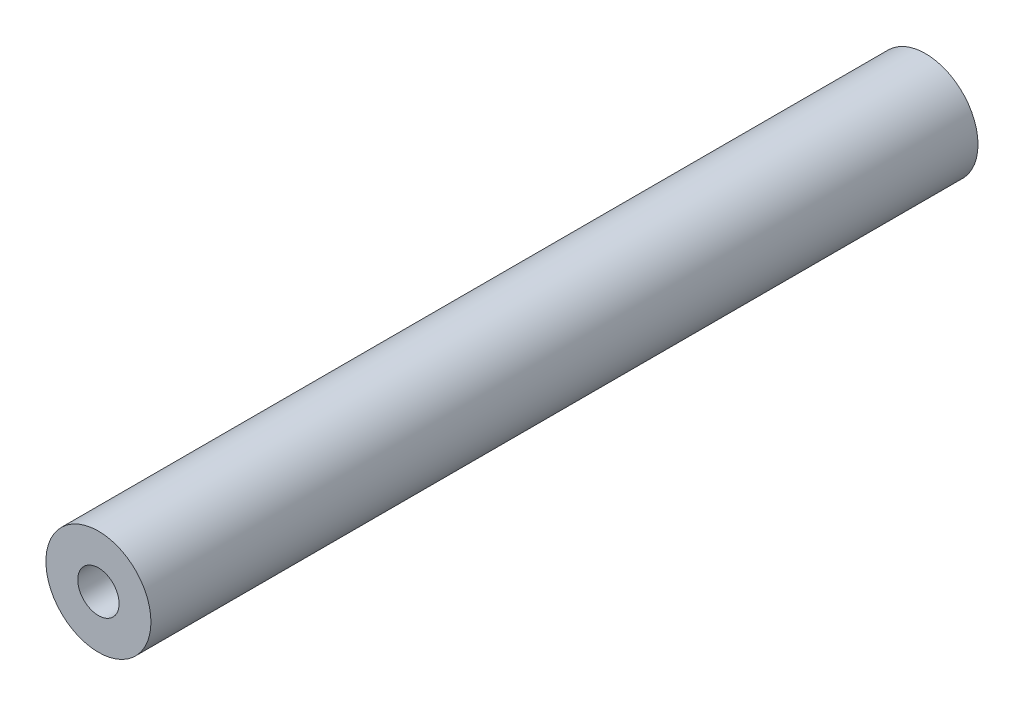
ISO-10303-21;
HEADER;
FILE_DESCRIPTION(('STEP AP214'),'2;1');
FILE_NAME('part.step','',(''),(''),'','','');
FILE_SCHEMA(('AUTOMOTIVE_DESIGN { 1 0 10303 214 1 1 1 1 }'));
ENDSEC;
DATA;
#1=APPLICATION_CONTEXT('core data for automotive mechanical design processes');
#2=APPLICATION_PROTOCOL_DEFINITION('international standard','automotive_design',2000,#1);
#3=PRODUCT_CONTEXT('',#1,'mechanical');
#4=PRODUCT('Part','Part','',(#3));
#5=PRODUCT_RELATED_PRODUCT_CATEGORY('part','',(#4));
#6=PRODUCT_DEFINITION_FORMATION('','',#4);
#7=PRODUCT_DEFINITION_CONTEXT('part definition',#1,'design');
#8=PRODUCT_DEFINITION('design','',#6,#7);
#9=PRODUCT_DEFINITION_SHAPE('','',#8);
#10=(LENGTH_UNIT() NAMED_UNIT(*) SI_UNIT(.MILLI.,.METRE.));
#11=(NAMED_UNIT(*) PLANE_ANGLE_UNIT() SI_UNIT($,.RADIAN.));
#12=(NAMED_UNIT(*) SI_UNIT($,.STERADIAN.) SOLID_ANGLE_UNIT());
#13=UNCERTAINTY_MEASURE_WITH_UNIT(LENGTH_MEASURE(1.E-05),#10,'distance_accuracy_value','');
#14=(GEOMETRIC_REPRESENTATION_CONTEXT(3) GLOBAL_UNCERTAINTY_ASSIGNED_CONTEXT((#13)) GLOBAL_UNIT_ASSIGNED_CONTEXT((#10,
#11,#12)) REPRESENTATION_CONTEXT('',''));
#15=CARTESIAN_POINT('',(0.,0.,0.));
#16=DIRECTION('',(0.,0.,1.));
#17=DIRECTION('',(1.,0.,0.));
#18=AXIS2_PLACEMENT_3D('',#15,#16,#17);
#19=CARTESIAN_POINT('',(0.,0.,50.));
#20=DIRECTION('',(0.,0.,-1.));
#21=DIRECTION('',(-1.,0.,0.));
#22=AXIS2_PLACEMENT_3D('',#19,#20,#21);
#23=CYLINDRICAL_SURFACE('',#22,6.35);
#24=CARTESIAN_POINT('',(0.,0.,50.));
#25=DIRECTION('',(0.,0.,1.));
#26=DIRECTION('',(1.,0.,0.));
#27=AXIS2_PLACEMENT_3D('',#24,#25,#26);
#28=CIRCLE('',#27,6.35);
#29=CARTESIAN_POINT('',(6.35,0.,50.));
#30=VERTEX_POINT('',#29);
#31=EDGE_CURVE('E11',#30,#30,#28,.T.);
#32=ORIENTED_EDGE('',*,*,#31,.F.);
#33=EDGE_LOOP('',(#32));
#34=FACE_BOUND('',#33,.T.);
#35=CARTESIAN_POINT('',(0.,0.,-50.));
#36=DIRECTION('',(0.,0.,1.));
#37=DIRECTION('',(1.,0.,0.));
#38=AXIS2_PLACEMENT_3D('',#35,#36,#37);
#39=CIRCLE('',#38,6.35);
#40=CARTESIAN_POINT('',(6.35,0.,-50.));
#41=VERTEX_POINT('',#40);
#42=EDGE_CURVE('E40',#41,#41,#39,.T.);
#43=ORIENTED_EDGE('',*,*,#42,.T.);
#44=EDGE_LOOP('',(#43));
#45=FACE_BOUND('',#44,.T.);
#46=ADVANCED_FACE('F37',(#34,#45),#23,.T.);
#47=CARTESIAN_POINT('',(0.,0.,50.));
#48=DIRECTION('',(0.,0.,1.));
#49=DIRECTION('',(1.,0.,0.));
#50=AXIS2_PLACEMENT_3D('',#47,#48,#49);
#51=PLANE('',#50);
#52=CARTESIAN_POINT('',(0.,0.,50.));
#53=DIRECTION('',(0.,0.,1.));
#54=DIRECTION('',(1.,0.,0.));
#55=AXIS2_PLACEMENT_3D('',#52,#53,#54);
#56=CIRCLE('',#55,2.49999999999999);
#57=CARTESIAN_POINT('',(2.49999999999999,0.,50.));
#58=VERTEX_POINT('',#57);
#59=EDGE_CURVE('E60',#58,#58,#56,.T.);
#60=ORIENTED_EDGE('',*,*,#59,.F.);
#61=EDGE_LOOP('',(#60));
#62=FACE_BOUND('',#61,.T.);
#63=ORIENTED_EDGE('',*,*,#31,.T.);
#64=EDGE_LOOP('',(#63));
#65=FACE_BOUND('',#64,.T.);
#66=ADVANCED_FACE('F79',(#62,#65),#51,.T.);
#67=CARTESIAN_POINT('',(0.,0.,-50.));
#68=DIRECTION('',(0.,0.,1.));
#69=DIRECTION('',(1.,0.,0.));
#70=AXIS2_PLACEMENT_3D('',#67,#68,#69);
#71=PLANE('',#70);
#72=CARTESIAN_POINT('',(0.,0.,-50.));
#73=DIRECTION('',(0.,0.,-1.));
#74=DIRECTION('',(-1.,0.,0.));
#75=AXIS2_PLACEMENT_3D('',#72,#73,#74);
#76=CIRCLE('',#75,2.49999999999999);
#77=CARTESIAN_POINT('',(-2.49999999999999,0.,-50.));
#78=VERTEX_POINT('',#77);
#79=EDGE_CURVE('E61',#78,#78,#76,.T.);
#80=ORIENTED_EDGE('',*,*,#79,.F.);
#81=EDGE_LOOP('',(#80));
#82=FACE_BOUND('',#81,.T.);
#83=ORIENTED_EDGE('',*,*,#42,.F.);
#84=EDGE_LOOP('',(#83));
#85=FACE_BOUND('',#84,.T.);
#86=ADVANCED_FACE('F76',(#82,#85),#71,.F.);
#87=CARTESIAN_POINT('',(0.,0.,33.));
#88=DIRECTION('',(0.,0.,1.));
#89=DIRECTION('',(1.,0.,0.));
#90=AXIS2_PLACEMENT_3D('',#87,#88,#89);
#91=CONICAL_SURFACE('',#90,2.5,1.02974425867665);
#92=CARTESIAN_POINT('',(0.,0.,31.4978484524311));
#93=VERTEX_POINT('',#92);
#94=VERTEX_LOOP('',#93);
#95=FACE_BOUND('',#94,.T.);
#96=CARTESIAN_POINT('',(0.,0.,33.));
#97=DIRECTION('',(0.,0.,1.));
#98=DIRECTION('',(1.,0.,0.));
#99=AXIS2_PLACEMENT_3D('',#96,#97,#98);
#100=CIRCLE('',#99,2.5);
#101=CARTESIAN_POINT('',(2.5,0.,33.));
#102=VERTEX_POINT('',#101);
#103=EDGE_CURVE('E64',#102,#102,#100,.T.);
#104=ORIENTED_EDGE('',*,*,#103,.T.);
#105=EDGE_LOOP('',(#104));
#106=FACE_BOUND('',#105,.T.);
#107=ADVANCED_FACE('F78',(#95,#106),#91,.F.);
#108=CARTESIAN_POINT('',(0.,0.,50.));
#109=DIRECTION('',(0.,0.,1.));
#110=DIRECTION('',(1.,0.,0.));
#111=AXIS2_PLACEMENT_3D('',#108,#109,#110);
#112=CYLINDRICAL_SURFACE('',#111,2.49999999999999);
#113=ORIENTED_EDGE('',*,*,#103,.F.);
#114=EDGE_LOOP('',(#113));
#115=FACE_BOUND('',#114,.T.);
#116=ORIENTED_EDGE('',*,*,#59,.T.);
#117=EDGE_LOOP('',(#116));
#118=FACE_BOUND('',#117,.T.);
#119=ADVANCED_FACE('F54',(#115,#118),#112,.F.);
#120=CARTESIAN_POINT('',(0.,0.,-33.));
#121=DIRECTION('',(0.,0.,-1.));
#122=DIRECTION('',(-1.,0.,0.));
#123=AXIS2_PLACEMENT_3D('',#120,#121,#122);
#124=CONICAL_SURFACE('',#123,2.5,1.02974425867665);
#125=CARTESIAN_POINT('',(0.,0.,-31.4978484524311));
#126=VERTEX_POINT('',#125);
#127=VERTEX_LOOP('',#126);
#128=FACE_BOUND('',#127,.T.);
#129=CARTESIAN_POINT('',(0.,0.,-33.));
#130=DIRECTION('',(0.,0.,-1.));
#131=DIRECTION('',(-1.,0.,0.));
#132=AXIS2_PLACEMENT_3D('',#129,#130,#131);
#133=CIRCLE('',#132,2.5);
#134=CARTESIAN_POINT('',(-2.5,0.,-33.));
#135=VERTEX_POINT('',#134);
#136=EDGE_CURVE('E58',#135,#135,#133,.T.);
#137=ORIENTED_EDGE('',*,*,#136,.T.);
#138=EDGE_LOOP('',(#137));
#139=FACE_BOUND('',#138,.T.);
#140=ADVANCED_FACE('F50',(#128,#139),#124,.F.);
#141=CARTESIAN_POINT('',(0.,0.,-50.));
#142=DIRECTION('',(0.,0.,-1.));
#143=DIRECTION('',(-1.,0.,0.));
#144=AXIS2_PLACEMENT_3D('',#141,#142,#143);
#145=CYLINDRICAL_SURFACE('',#144,2.49999999999999);
#146=ORIENTED_EDGE('',*,*,#136,.F.);
#147=EDGE_LOOP('',(#146));
#148=FACE_BOUND('',#147,.T.);
#149=ORIENTED_EDGE('',*,*,#79,.T.);
#150=EDGE_LOOP('',(#149));
#151=FACE_BOUND('',#150,.T.);
#152=ADVANCED_FACE('F53',(#148,#151),#145,.F.);
#153=CLOSED_SHELL('',(#46,#66,#86,#107,#119,#140,#152));
#154=MANIFOLD_SOLID_BREP('B2',#153);
#155=ADVANCED_BREP_SHAPE_REPRESENTATION('',(#18,#154),#14);
#156=SHAPE_DEFINITION_REPRESENTATION(#9,#155);
ENDSEC;
END-ISO-10303-21;
